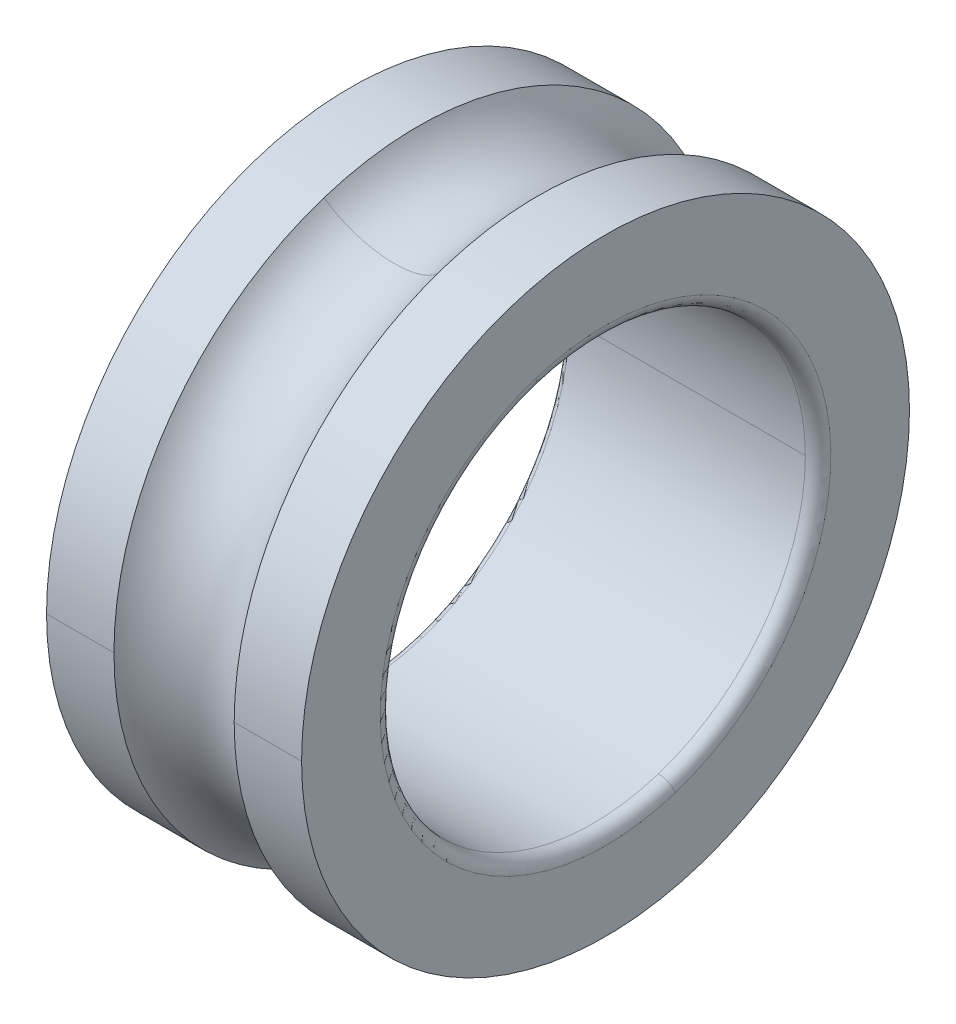
ISO-10303-21;
HEADER;
FILE_DESCRIPTION(('STEP AP214'),'2;1');
FILE_NAME('part.step','',(''),(''),'','','');
FILE_SCHEMA(('AUTOMOTIVE_DESIGN { 1 0 10303 214 1 1 1 1 }'));
ENDSEC;
DATA;
#1=APPLICATION_CONTEXT('core data for automotive mechanical design processes');
#2=APPLICATION_PROTOCOL_DEFINITION('international standard','automotive_design',2000,#1);
#3=PRODUCT_CONTEXT('',#1,'mechanical');
#4=PRODUCT('Part','Part','',(#3));
#5=PRODUCT_RELATED_PRODUCT_CATEGORY('part','',(#4));
#6=PRODUCT_DEFINITION_FORMATION('','',#4);
#7=PRODUCT_DEFINITION_CONTEXT('part definition',#1,'design');
#8=PRODUCT_DEFINITION('design','',#6,#7);
#9=PRODUCT_DEFINITION_SHAPE('','',#8);
#10=(LENGTH_UNIT() NAMED_UNIT(*) SI_UNIT(.MILLI.,.METRE.));
#11=(NAMED_UNIT(*) PLANE_ANGLE_UNIT() SI_UNIT($,.RADIAN.));
#12=(NAMED_UNIT(*) SI_UNIT($,.STERADIAN.) SOLID_ANGLE_UNIT());
#13=UNCERTAINTY_MEASURE_WITH_UNIT(LENGTH_MEASURE(1.E-05),#10,'distance_accuracy_value','');
#14=(GEOMETRIC_REPRESENTATION_CONTEXT(3) GLOBAL_UNCERTAINTY_ASSIGNED_CONTEXT((#13)) GLOBAL_UNIT_ASSIGNED_CONTEXT((#10,
#11,#12)) REPRESENTATION_CONTEXT('',''));
#15=CARTESIAN_POINT('',(0.,0.,0.));
#16=DIRECTION('',(0.,0.,1.));
#17=DIRECTION('',(1.,0.,0.));
#18=AXIS2_PLACEMENT_3D('',#15,#16,#17);
#19=CARTESIAN_POINT('',(0.,7.15,0.));
#20=DIRECTION('',(-1.,0.,0.));
#21=DIRECTION('',(0.,0.,1.));
#22=AXIS2_PLACEMENT_3D('',#19,#20,#21);
#23=PLANE('',#22);
#24=CARTESIAN_POINT('',(0.,0.,0.));
#25=DIRECTION('',(1.,0.,0.));
#26=DIRECTION('',(0.,0.,-1.));
#27=AXIS2_PLACEMENT_3D('',#24,#25,#26);
#28=CIRCLE('',#27,5.15);
#29=CARTESIAN_POINT('',(0.,4.89794105892004,1.59143752103098));
#30=VERTEX_POINT('',#29);
#31=CARTESIAN_POINT('',(0.,-4.89794105892004,-1.59143752103098));
#32=VERTEX_POINT('',#31);
#33=EDGE_CURVE('E11',#30,#32,#28,.T.);
#34=ORIENTED_EDGE('',*,*,#33,.T.);
#35=CARTESIAN_POINT('',(0.,-4.89794105892004,-1.59143752103098));
#36=CARTESIAN_POINT('',(0.,-4.39750759242677,-3.12948683662335));
#37=CARTESIAN_POINT('',(0.,-3.2957812973183,-4.47541454253524));
#38=CARTESIAN_POINT('',(0.,-1.68253692083019,-5.29531043653533));
#39=CARTESIAN_POINT('',(0.,1.78729033071666,-5.50071402699915));
#40=CARTESIAN_POINT('',(0.,4.47370634352078,-3.29502574514654));
#41=CARTESIAN_POINT('',(0.,5.29692574527113,-1.68347478043873));
#42=CARTESIAN_POINT('',(0.,5.39712458497675,0.0529820751716463));
#43=CARTESIAN_POINT('',(0.,4.89794105892004,1.59143752103098));
#44=B_SPLINE_CURVE_WITH_KNOTS('',5,(#35,#36,#37,#38,#39,#40,#41,#42,#43),.UNSPECIFIED.,.F.,.F.,
(6,3,6),(0.,1.5707963267949,3.14159265358979),.UNSPECIFIED.);
#45=EDGE_CURVE('E26',#32,#30,#44,.T.);
#46=ORIENTED_EDGE('',*,*,#45,.T.);
#47=EDGE_LOOP('',(#34,#46));
#48=FACE_BOUND('',#47,.T.);
#49=CARTESIAN_POINT('',(0.,0.,0.));
#50=DIRECTION('',(1.,0.,0.));
#51=DIRECTION('',(0.,0.,-1.));
#52=AXIS2_PLACEMENT_3D('',#49,#50,#51);
#53=CIRCLE('',#52,7.15);
#54=CARTESIAN_POINT('',(0.,0.,7.15));
#55=VERTEX_POINT('',#54);
#56=CARTESIAN_POINT('',(0.,0.,-7.15));
#57=VERTEX_POINT('',#56);
#58=EDGE_CURVE('E318',#55,#57,#53,.T.);
#59=ORIENTED_EDGE('',*,*,#58,.F.);
#60=CARTESIAN_POINT('',(0.,0.,0.));
#61=DIRECTION('',(1.,0.,0.));
#62=DIRECTION('',(0.,0.,-1.));
#63=AXIS2_PLACEMENT_3D('',#60,#61,#62);
#64=CIRCLE('',#63,7.15);
#65=EDGE_CURVE('E313',#57,#55,#64,.T.);
#66=ORIENTED_EDGE('',*,*,#65,.F.);
#67=EDGE_LOOP('',(#59,#66));
#68=FACE_BOUND('',#67,.T.);
#69=ADVANCED_FACE('F17',(#48,#68),#23,.T.);
#70=CARTESIAN_POINT('',(6.,0.,0.));
#71=DIRECTION('',(1.,0.,0.));
#72=DIRECTION('',(0.,-1.,0.));
#73=AXIS2_PLACEMENT_3D('',#70,#71,#72);
#74=CYLINDRICAL_SURFACE('',#73,7.15);
#75=DIRECTION('',(1.,0.,0.));
#76=VECTOR('',#75,1.);
#77=CARTESIAN_POINT('',(0.,0.,7.15));
#78=LINE('',#77,#76);
#79=CARTESIAN_POINT('',(1.5857864376269,0.,7.15));
#80=VERTEX_POINT('',#79);
#81=EDGE_CURVE('E309',#55,#80,#78,.T.);
#82=ORIENTED_EDGE('',*,*,#81,.T.);
#83=CARTESIAN_POINT('',(1.5857864376269,0.,0.));
#84=DIRECTION('',(1.,0.,0.));
#85=DIRECTION('',(0.,0.,-1.));
#86=AXIS2_PLACEMENT_3D('',#83,#84,#85);
#87=CIRCLE('',#86,7.15);
#88=CARTESIAN_POINT('',(1.5857864376269,6.80005409151035,2.20947150978087));
#89=VERTEX_POINT('',#88);
#90=EDGE_CURVE('E304',#89,#80,#87,.T.);
#91=ORIENTED_EDGE('',*,*,#90,.F.);
#92=CARTESIAN_POINT('',(1.5857864376269,0.,0.));
#93=DIRECTION('',(1.,0.,0.));
#94=DIRECTION('',(0.,0.,-1.));
#95=AXIS2_PLACEMENT_3D('',#92,#93,#94);
#96=CIRCLE('',#95,7.15);
#97=CARTESIAN_POINT('',(1.5857864376269,0.,-7.15));
#98=VERTEX_POINT('',#97);
#99=EDGE_CURVE('E299',#98,#89,#96,.T.);
#100=ORIENTED_EDGE('',*,*,#99,.F.);
#101=DIRECTION('',(1.,0.,0.));
#102=VECTOR('',#101,1.);
#103=CARTESIAN_POINT('',(0.,0.,-7.15));
#104=LINE('',#103,#102);
#105=EDGE_CURVE('E294',#57,#98,#104,.T.);
#106=ORIENTED_EDGE('',*,*,#105,.F.);
#107=ORIENTED_EDGE('',*,*,#65,.T.);
#108=EDGE_LOOP('',(#82,#91,#100,#106,#107));
#109=FACE_BOUND('',#108,.T.);
#110=ADVANCED_FACE('F339',(#109),#74,.T.);
#111=CARTESIAN_POINT('',(6.,0.,0.));
#112=DIRECTION('',(1.,0.,0.));
#113=DIRECTION('',(0.,1.,0.));
#114=AXIS2_PLACEMENT_3D('',#111,#112,#113);
#115=CYLINDRICAL_SURFACE('',#114,7.15);
#116=ORIENTED_EDGE('',*,*,#81,.F.);
#117=ORIENTED_EDGE('',*,*,#58,.T.);
#118=ORIENTED_EDGE('',*,*,#105,.T.);
#119=CARTESIAN_POINT('',(1.5857864376269,0.,0.));
#120=DIRECTION('',(1.,0.,0.));
#121=DIRECTION('',(0.,0.,-1.));
#122=AXIS2_PLACEMENT_3D('',#119,#120,#121);
#123=CIRCLE('',#122,7.15);
#124=CARTESIAN_POINT('',(1.58578643762691,-6.80005409151035,-2.20947150978087));
#125=VERTEX_POINT('',#124);
#126=EDGE_CURVE('E289',#125,#98,#123,.T.);
#127=ORIENTED_EDGE('',*,*,#126,.F.);
#128=CARTESIAN_POINT('',(1.5857864376269,0.,0.));
#129=DIRECTION('',(1.,0.,0.));
#130=DIRECTION('',(0.,0.,-1.));
#131=AXIS2_PLACEMENT_3D('',#128,#129,#130);
#132=CIRCLE('',#131,7.15);
#133=EDGE_CURVE('E284',#80,#125,#132,.T.);
#134=ORIENTED_EDGE('',*,*,#133,.F.);
#135=EDGE_LOOP('',(#116,#117,#118,#127,#134));
#136=FACE_BOUND('',#135,.T.);
#137=ADVANCED_FACE('F334',(#136),#115,.T.);
#138=CARTESIAN_POINT('',(3.,0.,0.));
#139=DIRECTION('',(1.,0.,0.));
#140=DIRECTION('',(0.,0.309016994374947,-0.951056516295154));
#141=AXIS2_PLACEMENT_3D('',#138,#139,#140);
#142=TOROIDAL_SURFACE('',#141,8.,1.65);
#143=CARTESIAN_POINT('',(3.,-7.60845213036123,-2.47213595499958));
#144=DIRECTION('',(0.,0.309016994374947,-0.951056516295154));
#145=DIRECTION('',(-0.857099128710967,0.48993820536417,0.159190572859821));
#146=AXIS2_PLACEMENT_3D('',#143,#144,#145);
#147=CIRCLE('',#146,1.65);
#148=CARTESIAN_POINT('',(4.4142135623731,-6.80005409151035,-2.20947150978087));
#149=VERTEX_POINT('',#148);
#150=EDGE_CURVE('E280',#125,#149,#147,.T.);
#151=ORIENTED_EDGE('',*,*,#150,.T.);
#152=CARTESIAN_POINT('',(4.4142135623731,0.,0.));
#153=DIRECTION('',(1.,0.,0.));
#154=DIRECTION('',(0.,0.,-1.));
#155=AXIS2_PLACEMENT_3D('',#152,#153,#154);
#156=CIRCLE('',#155,7.15);
#157=CARTESIAN_POINT('',(4.4142135623731,0.,7.15));
#158=VERTEX_POINT('',#157);
#159=EDGE_CURVE('E275',#158,#149,#156,.T.);
#160=ORIENTED_EDGE('',*,*,#159,.F.);
#161=CARTESIAN_POINT('',(4.4142135623731,0.,0.));
#162=DIRECTION('',(1.,0.,0.));
#163=DIRECTION('',(0.,0.,-1.));
#164=AXIS2_PLACEMENT_3D('',#161,#162,#163);
#165=CIRCLE('',#164,7.15);
#166=CARTESIAN_POINT('',(4.4142135623731,6.80005409151035,2.20947150978087));
#167=VERTEX_POINT('',#166);
#168=EDGE_CURVE('E270',#167,#158,#165,.T.);
#169=ORIENTED_EDGE('',*,*,#168,.F.);
#170=CARTESIAN_POINT('',(3.,7.60845213036123,2.47213595499958));
#171=DIRECTION('',(0.,-0.309016994374947,0.951056516295154));
#172=DIRECTION('',(-0.857099128710967,-0.48993820536417,-0.159190572859821));
#173=AXIS2_PLACEMENT_3D('',#170,#171,#172);
#174=CIRCLE('',#173,1.65);
#175=EDGE_CURVE('E265',#89,#167,#174,.T.);
#176=ORIENTED_EDGE('',*,*,#175,.F.);
#177=ORIENTED_EDGE('',*,*,#90,.T.);
#178=ORIENTED_EDGE('',*,*,#133,.T.);
#179=EDGE_LOOP('',(#151,#160,#169,#176,#177,#178));
#180=FACE_BOUND('',#179,.T.);
#181=ADVANCED_FACE('F346',(#180),#142,.F.);
#182=CARTESIAN_POINT('',(3.,0.,0.));
#183=DIRECTION('',(1.,0.,0.));
#184=DIRECTION('',(0.,-0.309016994374947,0.951056516295154));
#185=AXIS2_PLACEMENT_3D('',#182,#183,#184);
#186=TOROIDAL_SURFACE('',#185,8.,1.65);
#187=ORIENTED_EDGE('',*,*,#150,.F.);
#188=ORIENTED_EDGE('',*,*,#126,.T.);
#189=ORIENTED_EDGE('',*,*,#99,.T.);
#190=ORIENTED_EDGE('',*,*,#175,.T.);
#191=CARTESIAN_POINT('',(4.4142135623731,0.,0.));
#192=DIRECTION('',(1.,0.,0.));
#193=DIRECTION('',(0.,0.,-1.));
#194=AXIS2_PLACEMENT_3D('',#191,#192,#193);
#195=CIRCLE('',#194,7.15);
#196=CARTESIAN_POINT('',(4.4142135623731,0.,-7.15));
#197=VERTEX_POINT('',#196);
#198=EDGE_CURVE('E260',#197,#167,#195,.T.);
#199=ORIENTED_EDGE('',*,*,#198,.F.);
#200=CARTESIAN_POINT('',(4.4142135623731,0.,0.));
#201=DIRECTION('',(1.,0.,0.));
#202=DIRECTION('',(0.,0.,-1.));
#203=AXIS2_PLACEMENT_3D('',#200,#201,#202);
#204=CIRCLE('',#203,7.15);
#205=EDGE_CURVE('E255',#149,#197,#204,.T.);
#206=ORIENTED_EDGE('',*,*,#205,.F.);
#207=EDGE_LOOP('',(#187,#188,#189,#190,#199,#206));
#208=FACE_BOUND('',#207,.T.);
#209=ADVANCED_FACE('F343',(#208),#186,.F.);
#210=CARTESIAN_POINT('',(6.,0.,0.));
#211=DIRECTION('',(1.,0.,0.));
#212=DIRECTION('',(0.,1.,0.));
#213=AXIS2_PLACEMENT_3D('',#210,#211,#212);
#214=CYLINDRICAL_SURFACE('',#213,7.15);
#215=DIRECTION('',(1.,0.,0.));
#216=VECTOR('',#215,1.);
#217=CARTESIAN_POINT('',(4.4142135623731,0.,7.15));
#218=LINE('',#217,#216);
#219=CARTESIAN_POINT('',(6.,0.,7.15));
#220=VERTEX_POINT('',#219);
#221=EDGE_CURVE('E250',#158,#220,#218,.T.);
#222=ORIENTED_EDGE('',*,*,#221,.F.);
#223=ORIENTED_EDGE('',*,*,#159,.T.);
#224=ORIENTED_EDGE('',*,*,#205,.T.);
#225=DIRECTION('',(1.,0.,0.));
#226=VECTOR('',#225,1.);
#227=CARTESIAN_POINT('',(4.4142135623731,0.,-7.15));
#228=LINE('',#227,#226);
#229=CARTESIAN_POINT('',(6.,0.,-7.15));
#230=VERTEX_POINT('',#229);
#231=EDGE_CURVE('E246',#197,#230,#228,.T.);
#232=ORIENTED_EDGE('',*,*,#231,.T.);
#233=CARTESIAN_POINT('',(6.,0.,0.));
#234=DIRECTION('',(1.,0.,0.));
#235=DIRECTION('',(0.,0.,-1.));
#236=AXIS2_PLACEMENT_3D('',#233,#234,#235);
#237=CIRCLE('',#236,7.15);
#238=EDGE_CURVE('E241',#220,#230,#237,.T.);
#239=ORIENTED_EDGE('',*,*,#238,.F.);
#240=EDGE_LOOP('',(#222,#223,#224,#232,#239));
#241=FACE_BOUND('',#240,.T.);
#242=ADVANCED_FACE('F353',(#241),#214,.T.);
#243=CARTESIAN_POINT('',(6.,5.3,0.));
#244=DIRECTION('',(1.,0.,0.));
#245=DIRECTION('',(0.,0.,-1.));
#246=AXIS2_PLACEMENT_3D('',#243,#244,#245);
#247=PLANE('',#246);
#248=CARTESIAN_POINT('',(6.,0.,0.));
#249=DIRECTION('',(1.,0.,0.));
#250=DIRECTION('',(0.,0.,-1.));
#251=AXIS2_PLACEMENT_3D('',#248,#249,#250);
#252=CIRCLE('',#251,7.15);
#253=EDGE_CURVE('E238',#230,#220,#252,.T.);
#254=ORIENTED_EDGE('',*,*,#253,.T.);
#255=ORIENTED_EDGE('',*,*,#238,.T.);
#256=EDGE_LOOP('',(#254,#255));
#257=FACE_BOUND('',#256,.T.);
#258=CARTESIAN_POINT('',(6.,-5.0405995363642,-1.63779007018719));
#259=CARTESIAN_POINT('',(6.,-5.01380298148037,-1.72026733898135));
#260=CARTESIAN_POINT('',(6.,-4.984978757443,-1.80208561354531));
#261=CARTESIAN_POINT('',(6.,-4.92335196993667,-1.96420994002703));
#262=CARTESIAN_POINT('',(6.,-4.8905494064677,-2.04451599194481));
#263=CARTESIAN_POINT('',(6.,-4.82104293897371,-2.20342163894841));
#264=CARTESIAN_POINT('',(6.,-4.78433903494868,-2.28202123403423));
#265=CARTESIAN_POINT('',(6.,-4.70711885195929,-2.43732482035164));
#266=CARTESIAN_POINT('',(6.,-4.66660257299494,-2.51402881158322));
#267=CARTESIAN_POINT('',(6.,-4.5818551019765,-2.6653563482844));
#268=CARTESIAN_POINT('',(6.,-4.53762390992241,-2.73997989375401));
#269=CARTESIAN_POINT('',(6.,-4.44555320850426,-2.88696677908468));
#270=CARTESIAN_POINT('',(6.,-4.3977136991402,-2.95933011894575));
#271=CARTESIAN_POINT('',(6.,-4.29854160223004,-3.10162225946682));
#272=CARTESIAN_POINT('',(6.,-4.24720901468396,-3.17155106012682));
#273=CARTESIAN_POINT('',(6.,-4.14117442890684,-3.3088056587033));
#274=CARTESIAN_POINT('',(6.,-4.08647243067582,-3.37613145661977));
#275=CARTESIAN_POINT('',(6.,-3.97383080468432,-3.50801785568003));
#276=CARTESIAN_POINT('',(6.,-3.91589117692384,-3.57257845682382));
#277=CARTESIAN_POINT('',(6.,-3.79691387371247,-3.69877893027207));
#278=CARTESIAN_POINT('',(6.,-3.73587619826158,-3.76041880257652));
#279=CARTESIAN_POINT('',(6.,-3.61084984472199,-3.88062932247425));
#280=CARTESIAN_POINT('',(6.,-3.54686116663329,-3.93919997006752));
#281=CARTESIAN_POINT('',(6.,-3.41608696216278,-4.05313093872812));
#282=CARTESIAN_POINT('',(6.,-3.34930143578096,-4.10849125979545));
#283=CARTESIAN_POINT('',(6.,-3.21309442690312,-4.21586820754026));
#284=CARTESIAN_POINT('',(6.,-3.1436729444071,-4.26788483421774));
#285=CARTESIAN_POINT('',(6.,-3.00236126573381,-4.36844908057346));
#286=CARTESIAN_POINT('',(6.,-2.93047106955654,-4.41699670025169));
#287=CARTESIAN_POINT('',(6.,-2.78439515329993,-4.51050597714075));
#288=CARTESIAN_POINT('',(6.,-2.71020943322058,-4.55546763435156));
#289=CARTESIAN_POINT('',(6.,-2.55972118905744,-4.6416966697354));
#290=CARTESIAN_POINT('',(6.,-2.48341866497365,-4.68296404790842));
#291=CARTESIAN_POINT('',(6.,-2.32888063226544,-4.76170510848806));
#292=CARTESIAN_POINT('',(6.,-2.25064512364102,-4.79917879089467));
#293=CARTESIAN_POINT('',(6.,-2.09242959804445,-4.87024218255826));
#294=CARTESIAN_POINT('',(6.,-2.01244958107231,-4.90383189181524));
#295=CARTESIAN_POINT('',(6.,-1.85093771764659,-4.96704641662785));
#296=CARTESIAN_POINT('',(6.,-1.76940587119303,-4.99667123218348));
#297=CARTESIAN_POINT('',(6.,-1.60498676616393,-5.0518846008179));
#298=CARTESIAN_POINT('',(6.,-1.52209950758839,-5.07747315389668));
#299=CARTESIAN_POINT('',(6.,-1.35516926098133,-5.12455235251175));
#300=CARTESIAN_POINT('',(6.,-1.27112627294981,-5.14604299804802));
#301=CARTESIAN_POINT('',(6.,-1.10208703435023,-5.18487460873062));
#302=CARTESIAN_POINT('',(6.,-1.01709078378217,-5.20221557387694));
#303=CARTESIAN_POINT('',(6.,-0.846349783521949,-5.23270604787568));
#304=CARTESIAN_POINT('',(6.,-0.760605033829778,-5.24585555672811));
#305=CARTESIAN_POINT('',(6.,-0.588573601933679,-5.26793143982049));
#306=CARTESIAN_POINT('',(6.,-0.502286919729752,-5.27685781406044));
#307=CARTESIAN_POINT('',(6.,-0.329379494985391,-5.29046592351047));
#308=CARTESIAN_POINT('',(6.,-0.242758752444958,-5.29514765872055));
#309=CARTESIAN_POINT('',(6.,-0.0693918839834476,-5.30025521140063));
#310=CARTESIAN_POINT('',(6.,0.0173542419376295,-5.30068102887064));
#311=CARTESIAN_POINT('',(6.,0.190762898145021,-5.297275720239));
#312=CARTESIAN_POINT('',(6.,0.277425428431336,-5.29344459413736));
#313=CARTESIAN_POINT('',(6.,0.450458115743003,-5.28153462788077));
#314=CARTESIAN_POINT('',(6.,0.536828272768355,-5.27345578772582));
#315=CARTESIAN_POINT('',(6.,0.709068140284688,-5.25306985599617));
#316=CARTESIAN_POINT('',(6.,0.794937850775669,-5.24076276442147));
#317=CARTESIAN_POINT('',(6.,0.965969957569393,-5.21194997871389));
#318=CARTESIAN_POINT('',(6.,1.05113235387213,-5.19544428458102));
#319=CARTESIAN_POINT('',(6.,1.22054466861734,-5.15827405742));
#320=CARTESIAN_POINT('',(6.,1.3047945870598,-5.13760952439185));
#321=CARTESIAN_POINT('',(6.,1.4721789806515,-5.09217140211033));
#322=CARTESIAN_POINT('',(6.,1.55531345580074,-5.06739781285696));
#323=CARTESIAN_POINT('',(6.,1.72026668457362,-5.01380125987144));
#324=CARTESIAN_POINT('',(6.,1.80208543819727,-4.98497829613928));
#325=CARTESIAN_POINT('',(6.,1.96421011537504,-4.9233524312404));
#326=CARTESIAN_POINT('',(6.,2.04451603892915,-4.89054953007367));
#327=CARTESIAN_POINT('',(6.,2.20342159196403,-4.82104281536775));
#328=CARTESIAN_POINT('',(6.,2.2820212214448,-4.78433900182857));
#329=CARTESIAN_POINT('',(6.,2.43732483294105,-4.70711888507941));
#330=CARTESIAN_POINT('',(6.,2.51402881495653,-4.66660258186945));
#331=CARTESIAN_POINT('',(6.,2.66535634491106,-4.581855093102));
#332=CARTESIAN_POINT('',(6.,2.73997989285011,-4.5376239075445));
#333=CARTESIAN_POINT('',(6.,2.88696677998855,-4.44555321088219));
#334=CARTESIAN_POINT('',(6.,2.95933011918793,-4.39771369977737));
#335=CARTESIAN_POINT('',(6.,3.10162225922461,-4.29854160159289));
#336=CARTESIAN_POINT('',(6.,3.17155106006191,-4.24720901451324));
#337=CARTESIAN_POINT('',(6.,3.30880565876818,-4.14117442907758));
#338=CARTESIAN_POINT('',(6.,3.37613145663715,-4.08647243072158));
#339=CARTESIAN_POINT('',(6.,3.50801785566263,-3.97383080463858));
#340=CARTESIAN_POINT('',(6.,3.57257845681915,-3.91589117691159));
#341=CARTESIAN_POINT('',(6.,3.69877893027671,-3.79691387372474));
#342=CARTESIAN_POINT('',(6.,3.76041880257776,-3.73587619826487));
#343=CARTESIAN_POINT('',(6.,3.88062932247299,-3.61084984471872));
#344=CARTESIAN_POINT('',(6.,3.93919997006717,-3.54686116663243));
#345=CARTESIAN_POINT('',(6.,4.05313093872844,-3.41608696216367));
#346=CARTESIAN_POINT('',(6.,4.10849125979553,-3.34930143578121));
#347=CARTESIAN_POINT('',(6.,4.21586820754016,-3.2130944269029));
#348=CARTESIAN_POINT('',(6.,4.26788483421771,-3.14367294440705));
#349=CARTESIAN_POINT('',(6.,4.36844908057347,-3.00236126573388));
#350=CARTESIAN_POINT('',(6.,4.41699670025169,-2.93047106955657));
#351=CARTESIAN_POINT('',(6.,4.51050597714073,-2.78439515329993));
#352=CARTESIAN_POINT('',(6.,4.55546763435155,-2.71020943322059));
#353=CARTESIAN_POINT('',(6.,4.64169666973539,-2.55972118905746));
#354=CARTESIAN_POINT('',(6.,4.68296404790842,-2.48341866497366));
#355=CARTESIAN_POINT('',(6.,4.76170510848805,-2.32888063226545));
#356=CARTESIAN_POINT('',(6.,4.79917879089466,-2.25064512364103));
#357=CARTESIAN_POINT('',(6.,4.87024218255826,-2.09242959804446));
#358=CARTESIAN_POINT('',(6.,4.90383189181526,-2.01244958107231));
#359=CARTESIAN_POINT('',(6.,4.96704641662783,-1.85093771764661));
#360=CARTESIAN_POINT('',(6.,4.99667123218341,-1.76940587119306));
#361=CARTESIAN_POINT('',(6.,5.05188460081796,-1.60498676616392));
#362=CARTESIAN_POINT('',(6.,5.07747315389692,-1.52209950758834));
#363=CARTESIAN_POINT('',(6.,5.1245523525115,-1.35516926098141));
#364=CARTESIAN_POINT('',(6.,5.14604299804711,-1.27112627295007));
#365=CARTESIAN_POINT('',(6.,5.18487460873152,-1.10208703434999));
#366=CARTESIAN_POINT('',(6.,5.20221557388032,-1.01709078378127));
#367=CARTESIAN_POINT('',(6.,5.23270604787229,-0.846349783522884));
#368=CARTESIAN_POINT('',(6.,5.24585555671545,-0.760605033833228));
#369=CARTESIAN_POINT('',(6.,5.26793143983314,-0.588573601930259));
#370=CARTESIAN_POINT('',(6.,5.27685781410767,-0.502286919716947));
#371=CARTESIAN_POINT('',(6.,5.29046592346324,-0.32937949499823));
#372=CARTESIAN_POINT('',(6.,5.29514765854428,-0.242758752492825));
#373=CARTESIAN_POINT('',(6.,5.3002552115769,-0.0693918839356178));
#374=CARTESIAN_POINT('',(6.,5.30068102952847,0.0173542421161853));
#375=CARTESIAN_POINT('',(6.,5.29727571958118,0.190762897966428));
#376=CARTESIAN_POINT('',(6.,5.2934445916823,0.277425427764867));
#377=CARTESIAN_POINT('',(6.,5.28153463033583,0.450458116409436));
#378=CARTESIAN_POINT('',(6.,5.27345579688824,0.536828275255567));
#379=CARTESIAN_POINT('',(6.,5.25306984683375,0.709068137797446));
#380=CARTESIAN_POINT('',(6.,5.24076273022685,0.794937841493196));
#381=CARTESIAN_POINT('',(6.,5.21195001290851,0.965969966851841));
#382=CARTESIAN_POINT('',(6.,5.19544441219706,1.05113238851474));
#383=CARTESIAN_POINT('',(6.,5.15827392980396,1.22054463397471));
#384=CARTESIAN_POINT('',(6.,5.13760904812232,1.30479445777179));
#385=CARTESIAN_POINT('',(6.,5.09217187837987,1.47217910993948));
#386=CARTESIAN_POINT('',(6.,5.06739959031906,1.5553139383101));
#387=CARTESIAN_POINT('',(6.,5.04059953636421,1.63779007018716));
#388=B_SPLINE_CURVE_WITH_KNOTS('',3,(#258,#259,#260,#261,#262,#263,#264,#265,#266,#267,#268,
#269,#270,#271,#272,#273,#274,#275,#276,#277,#278,#279,#280,#281,#282,#283,#284,#285,#286,#287,
#288,#289,#290,#291,#292,#293,#294,#295,#296,#297,#298,#299,#300,#301,#302,#303,#304,#305,#306,
#307,#308,#309,#310,#311,#312,#313,#314,#315,#316,#317,#318,#319,#320,#321,#322,#323,#324,#325,
#326,#327,#328,#329,#330,#331,#332,#333,#334,#335,#336,#337,#338,#339,#340,#341,#342,#343,#344,
#345,#346,#347,#348,#349,#350,#351,#352,#353,#354,#355,#356,#357,#358,#359,#360,#361,#362,#363,
#364,#365,#366,#367,#368,#369,#370,#371,#372,#373,#374,#375,#376,#377,#378,#379,#380,#381,#382,
#383,#384,#385,#386,#387),.UNSPECIFIED.,.F.,.F.,(4,2,2,2,2,2,2,2,2,2,2,2,2,2,2,2,2,2,2,2,2,2,2,
2,2,2,2,2,2,2,2,2,2,2,2,2,2,2,2,2,2,2,2,2,2,2,2,2,2,2,2,2,2,2,2,2,2,2,2,2,2,2,2,2,4),(0.,
0.260137022342863,0.520274044685728,0.780411067028592,1.04054808937146,1.30068511171432,
1.56082213405718,1.82095915640005,2.08109617874291,2.34123320108577,2.60137022342864,
2.8615072457715,3.12164426811437,3.38178129045723,3.6419183128001,3.90205533514296,
4.16219235748582,4.42232937982869,4.68246640217155,4.94260342451441,5.20274044685728,
5.46287746920014,5.723014491543,5.98315151388587,6.24328853622873,6.5034255585716,
6.76356258091446,7.02369960325732,7.28383662560019,7.54397364794305,7.80411067028592,
8.06424769262878,8.32438471497164,8.5845217373145,8.84465875965737,9.10479578200023,
9.3649328043431,9.62506982668596,9.88520684902883,10.1453438713717,10.4054808937146,
10.6656179160574,10.9257549384003,11.1858919607431,11.446028983086,11.7061660054289,
11.9663030277717,12.2264400501146,12.4865770724575,12.7467140948003,13.0068511171432,
13.2669881394861,13.5271251618289,13.7872621841718,14.0473992065146,14.3075362288575,
14.5676732512004,14.8278102735432,15.0879472958861,15.348084318229,15.6082213405718,
15.8683583629147,16.1284953852576,16.3886324076004,16.6487694299433),.UNSPECIFIED.);
#389=CARTESIAN_POINT('',(6.,-5.0405995363642,-1.63779007018718));
#390=VERTEX_POINT('',#389);
#391=CARTESIAN_POINT('',(6.,5.0405995363642,1.63779007018718));
#392=VERTEX_POINT('',#391);
#393=EDGE_CURVE('E237',#390,#392,#388,.T.);
#394=ORIENTED_EDGE('',*,*,#393,.F.);
#395=CARTESIAN_POINT('',(6.,5.0405995363642,1.63779007018719));
#396=CARTESIAN_POINT('',(6.,5.01380298148038,1.72026733898135));
#397=CARTESIAN_POINT('',(6.,4.984978757443,1.80208561354531));
#398=CARTESIAN_POINT('',(6.,4.92335196993667,1.96420994002703));
#399=CARTESIAN_POINT('',(6.,4.8905494064677,2.04451599194481));
#400=CARTESIAN_POINT('',(6.,4.82104293897371,2.20342163894841));
#401=CARTESIAN_POINT('',(6.,4.78433903494868,2.28202123403423));
#402=CARTESIAN_POINT('',(6.,4.70711885195929,2.43732482035164));
#403=CARTESIAN_POINT('',(6.,4.66660257299494,2.51402881158322));
#404=CARTESIAN_POINT('',(6.,4.5818551019765,2.6653563482844));
#405=CARTESIAN_POINT('',(6.,4.53762390992241,2.73997989375401));
#406=CARTESIAN_POINT('',(6.,4.44555320850426,2.88696677908468));
#407=CARTESIAN_POINT('',(6.,4.3977136991402,2.95933011894575));
#408=CARTESIAN_POINT('',(6.,4.29854160223004,3.10162225946682));
#409=CARTESIAN_POINT('',(6.,4.24720901468395,3.17155106012682));
#410=CARTESIAN_POINT('',(6.,4.14117442890684,3.3088056587033));
#411=CARTESIAN_POINT('',(6.,4.08647243067582,3.37613145661977));
#412=CARTESIAN_POINT('',(6.,3.97383080468432,3.50801785568003));
#413=CARTESIAN_POINT('',(6.,3.91589117692384,3.57257845682382));
#414=CARTESIAN_POINT('',(6.,3.79691387371247,3.69877893027207));
#415=CARTESIAN_POINT('',(6.,3.73587619826158,3.76041880257652));
#416=CARTESIAN_POINT('',(6.,3.61084984472199,3.88062932247425));
#417=CARTESIAN_POINT('',(6.,3.54686116663329,3.93919997006752));
#418=CARTESIAN_POINT('',(6.,3.41608696216278,4.05313093872812));
#419=CARTESIAN_POINT('',(6.,3.34930143578096,4.10849125979545));
#420=CARTESIAN_POINT('',(6.,3.21309442690312,4.21586820754026));
#421=CARTESIAN_POINT('',(6.,3.14367294440709,4.26788483421774));
#422=CARTESIAN_POINT('',(6.,3.0023612657338,4.36844908057346));
#423=CARTESIAN_POINT('',(6.,2.93047106955654,4.41699670025169));
#424=CARTESIAN_POINT('',(6.,2.78439515329992,4.51050597714075));
#425=CARTESIAN_POINT('',(6.,2.71020943322057,4.55546763435156));
#426=CARTESIAN_POINT('',(6.,2.55972118905743,4.6416966697354));
#427=CARTESIAN_POINT('',(6.,2.48341866497364,4.68296404790843));
#428=CARTESIAN_POINT('',(6.,2.32888063226543,4.76170510848806));
#429=CARTESIAN_POINT('',(6.,2.25064512364101,4.79917879089468));
#430=CARTESIAN_POINT('',(6.,2.09242959804445,4.87024218255827));
#431=CARTESIAN_POINT('',(6.,2.0124495810723,4.90383189181525));
#432=CARTESIAN_POINT('',(6.,1.85093771764659,4.96704641662785));
#433=CARTESIAN_POINT('',(6.,1.76940587119302,4.99667123218348));
#434=CARTESIAN_POINT('',(6.,1.60498676616392,5.0518846008179));
#435=CARTESIAN_POINT('',(6.,1.52209950758839,5.07747315389669));
#436=CARTESIAN_POINT('',(6.,1.35516926098133,5.12455235251175));
#437=CARTESIAN_POINT('',(6.,1.2711262729498,5.14604299804803));
#438=CARTESIAN_POINT('',(6.,1.10208703435022,5.18487460873062));
#439=CARTESIAN_POINT('',(6.,1.01709078378216,5.20221557387694));
#440=CARTESIAN_POINT('',(6.,0.846349783521938,5.23270604787568));
#441=CARTESIAN_POINT('',(6.,0.760605033829767,5.24585555672811));
#442=CARTESIAN_POINT('',(6.,0.588573601933669,5.26793143982049));
#443=CARTESIAN_POINT('',(6.,0.502286919729742,5.27685781406044));
#444=CARTESIAN_POINT('',(6.,0.329379494985383,5.29046592351047));
#445=CARTESIAN_POINT('',(6.,0.242758752444951,5.29514765872055));
#446=CARTESIAN_POINT('',(6.,0.0693918839834412,5.30025521140063));
#447=CARTESIAN_POINT('',(6.,-0.017354241937636,5.30068102887064));
#448=CARTESIAN_POINT('',(6.,-0.190762898145028,5.29727572023901));
#449=CARTESIAN_POINT('',(6.,-0.277425428431343,5.29344459413736));
#450=CARTESIAN_POINT('',(6.,-0.45045811574301,5.28153462788077));
#451=CARTESIAN_POINT('',(6.,-0.536828272768361,5.27345578772581));
#452=CARTESIAN_POINT('',(6.,-0.709068140284695,5.25306985599617));
#453=CARTESIAN_POINT('',(6.,-0.794937850775677,5.24076276442146));
#454=CARTESIAN_POINT('',(6.,-0.965969957569402,5.21194997871389));
#455=CARTESIAN_POINT('',(6.,-1.05113235387214,5.19544428458102));
#456=CARTESIAN_POINT('',(6.,-1.22054466861735,5.15827405741999));
#457=CARTESIAN_POINT('',(6.,-1.30479458705981,5.13760952439184));
#458=CARTESIAN_POINT('',(6.,-1.47217898065151,5.09217140211033));
#459=CARTESIAN_POINT('',(6.,-1.55531345580074,5.06739781285696));
#460=CARTESIAN_POINT('',(6.,-1.72026668457363,5.01380125987144));
#461=CARTESIAN_POINT('',(6.,-1.80208543819728,4.98497829613928));
#462=CARTESIAN_POINT('',(6.,-1.96421011537505,4.9233524312404));
#463=CARTESIAN_POINT('',(6.,-2.04451603892916,4.89054953007367));
#464=CARTESIAN_POINT('',(6.,-2.20342159196404,4.82104281536775));
#465=CARTESIAN_POINT('',(6.,-2.28202122144481,4.78433900182856));
#466=CARTESIAN_POINT('',(6.,-2.43732483294105,4.70711888507941));
#467=CARTESIAN_POINT('',(6.,-2.51402881495654,4.66660258186945));
#468=CARTESIAN_POINT('',(6.,-2.66535634491107,4.58185509310199));
#469=CARTESIAN_POINT('',(6.,-2.73997989285012,4.5376239075445));
#470=CARTESIAN_POINT('',(6.,-2.88696677998855,4.44555321088218));
#471=CARTESIAN_POINT('',(6.,-2.95933011918793,4.39771369977736));
#472=CARTESIAN_POINT('',(6.,-3.10162225922462,4.29854160159289));
#473=CARTESIAN_POINT('',(6.,-3.17155106006192,4.24720901451323));
#474=CARTESIAN_POINT('',(6.,-3.30880565876819,4.14117442907757));
#475=CARTESIAN_POINT('',(6.,-3.37613145663715,4.08647243072157));
#476=CARTESIAN_POINT('',(6.,-3.50801785566264,3.97383080463858));
#477=CARTESIAN_POINT('',(6.,-3.57257845681916,3.91589117691159));
#478=CARTESIAN_POINT('',(6.,-3.69877893027672,3.79691387372473));
#479=CARTESIAN_POINT('',(6.,-3.76041880257777,3.73587619826487));
#480=CARTESIAN_POINT('',(6.,-3.880629322473,3.61084984471871));
#481=CARTESIAN_POINT('',(6.,-3.93919997006718,3.54686116663242));
#482=CARTESIAN_POINT('',(6.,-4.05313093872845,3.41608696216367));
#483=CARTESIAN_POINT('',(6.,-4.10849125979554,3.34930143578121));
#484=CARTESIAN_POINT('',(6.,-4.21586820754017,3.21309442690289));
#485=CARTESIAN_POINT('',(6.,-4.26788483421771,3.14367294440704));
#486=CARTESIAN_POINT('',(6.,-4.36844908057348,3.00236126573387));
#487=CARTESIAN_POINT('',(6.,-4.4169967002517,2.93047106955656));
#488=CARTESIAN_POINT('',(6.,-4.51050597714074,2.78439515329991));
#489=CARTESIAN_POINT('',(6.,-4.55546763435156,2.71020943322058));
#490=CARTESIAN_POINT('',(6.,-4.6416966697354,2.55972118905744));
#491=CARTESIAN_POINT('',(6.,-4.68296404790843,2.48341866497365));
#492=CARTESIAN_POINT('',(6.,-4.76170510848806,2.32888063226544));
#493=CARTESIAN_POINT('',(6.,-4.79917879089467,2.25064512364102));
#494=CARTESIAN_POINT('',(6.,-4.87024218255827,2.09242959804445));
#495=CARTESIAN_POINT('',(6.,-4.90383189181526,2.0124495810723));
#496=CARTESIAN_POINT('',(6.,-4.96704641662783,1.8509377176466));
#497=CARTESIAN_POINT('',(6.,-4.99667123218342,1.76940587119305));
#498=CARTESIAN_POINT('',(6.,-5.05188460081796,1.60498676616391));
#499=CARTESIAN_POINT('',(6.,-5.07747315389693,1.52209950758833));
#500=CARTESIAN_POINT('',(6.,-5.1245523525115,1.3551692609814));
#501=CARTESIAN_POINT('',(6.,-5.14604299804712,1.27112627295005));
#502=CARTESIAN_POINT('',(6.,-5.18487460873153,1.10208703434998));
#503=CARTESIAN_POINT('',(6.,-5.20221557388033,1.01709078378125));
#504=CARTESIAN_POINT('',(6.,-5.23270604787229,0.846349783522868));
#505=CARTESIAN_POINT('',(6.,-5.24585555671545,0.760605033833212));
#506=CARTESIAN_POINT('',(6.,-5.26793143983314,0.588573601930243));
#507=CARTESIAN_POINT('',(6.,-5.27685781410768,0.502286919716931));
#508=CARTESIAN_POINT('',(6.,-5.29046592346324,0.329379494998214));
#509=CARTESIAN_POINT('',(6.,-5.29514765854429,0.242758752492809));
#510=CARTESIAN_POINT('',(6.,-5.3002552115769,0.0693918839356017));
#511=CARTESIAN_POINT('',(6.,-5.30068102952847,-0.0173542421162013));
#512=CARTESIAN_POINT('',(6.,-5.29727571958118,-0.190762897966443));
#513=CARTESIAN_POINT('',(6.,-5.2934445916823,-0.277425427764883));
#514=CARTESIAN_POINT('',(6.,-5.28153463033583,-0.450458116409452));
#515=CARTESIAN_POINT('',(6.,-5.27345579688824,-0.536828275255583));
#516=CARTESIAN_POINT('',(6.,-5.25306984683375,-0.709068137797462));
#517=CARTESIAN_POINT('',(6.,-5.24076273022685,-0.794937841493212));
#518=CARTESIAN_POINT('',(6.,-5.21195001290851,-0.965969966851857));
#519=CARTESIAN_POINT('',(6.,-5.19544441219706,-1.05113238851475));
#520=CARTESIAN_POINT('',(6.,-5.15827392980396,-1.22054463397473));
#521=CARTESIAN_POINT('',(6.,-5.13760904812231,-1.3047944577718));
#522=CARTESIAN_POINT('',(6.,-5.09217187837986,-1.4721791099395));
#523=CARTESIAN_POINT('',(6.,-5.06739959031906,-1.55531393831012));
#524=CARTESIAN_POINT('',(6.,-5.0405995363642,-1.63779007018718));
#525=B_SPLINE_CURVE_WITH_KNOTS('',3,(#395,#396,#397,#398,#399,#400,#401,#402,#403,#404,#405,
#406,#407,#408,#409,#410,#411,#412,#413,#414,#415,#416,#417,#418,#419,#420,#421,#422,#423,#424,
#425,#426,#427,#428,#429,#430,#431,#432,#433,#434,#435,#436,#437,#438,#439,#440,#441,#442,#443,
#444,#445,#446,#447,#448,#449,#450,#451,#452,#453,#454,#455,#456,#457,#458,#459,#460,#461,#462,
#463,#464,#465,#466,#467,#468,#469,#470,#471,#472,#473,#474,#475,#476,#477,#478,#479,#480,#481,
#482,#483,#484,#485,#486,#487,#488,#489,#490,#491,#492,#493,#494,#495,#496,#497,#498,#499,#500,
#501,#502,#503,#504,#505,#506,#507,#508,#509,#510,#511,#512,#513,#514,#515,#516,#517,#518,#519,
#520,#521,#522,#523,#524),.UNSPECIFIED.,.F.,.F.,(4,2,2,2,2,2,2,2,2,2,2,2,2,2,2,2,2,2,2,2,2,2,2,
2,2,2,2,2,2,2,2,2,2,2,2,2,2,2,2,2,2,2,2,2,2,2,2,2,2,2,2,2,2,2,2,2,2,2,2,2,2,2,2,2,4),(0.,
0.260137022342863,0.520274044685728,0.780411067028592,1.04054808937146,1.30068511171432,
1.56082213405719,1.82095915640005,2.08109617874291,2.34123320108578,2.60137022342864,
2.86150724577151,3.12164426811437,3.38178129045723,3.6419183128001,3.90205533514296,
4.16219235748583,4.42232937982869,4.68246640217156,4.94260342451442,5.20274044685728,
5.46287746920015,5.72301449154301,5.98315151388588,6.24328853622874,6.5034255585716,
6.76356258091447,7.02369960325733,7.28383662560019,7.54397364794306,7.80411067028592,
8.06424769262879,8.32438471497165,8.58452173731452,8.84465875965738,9.10479578200025,
9.36493280434311,9.62506982668597,9.88520684902883,10.1453438713717,10.4054808937146,
10.6656179160574,10.9257549384003,11.1858919607432,11.446028983086,11.7061660054289,
11.9663030277717,12.2264400501146,12.4865770724575,12.7467140948003,13.0068511171432,
13.2669881394861,13.5271251618289,13.7872621841718,14.0473992065147,14.3075362288575,
14.5676732512004,14.8278102735433,15.0879472958861,15.348084318229,15.6082213405718,
15.8683583629147,16.1284953852576,16.3886324076004,16.6487694299433),.UNSPECIFIED.);
#526=EDGE_CURVE('E200',#392,#390,#525,.T.);
#527=ORIENTED_EDGE('',*,*,#526,.F.);
#528=EDGE_LOOP('',(#394,#527));
#529=FACE_BOUND('',#528,.T.);
#530=ADVANCED_FACE('F185',(#257,#529),#247,.T.);
#531=CARTESIAN_POINT('',(5.70000000000012,0.,0.));
#532=DIRECTION('',(1.,0.,0.));
#533=DIRECTION('',(0.,0.309016994374947,-0.951056516295154));
#534=AXIS2_PLACEMENT_3D('',#531,#532,#533);
#535=TOROIDAL_SURFACE('',#534,5.29999999999988,0.299999999999878);
#536=CARTESIAN_POINT('',(5.70000000000012,-5.0405995363642,-1.63779007018718));
#537=DIRECTION('',(0.,0.309016994374947,-0.951056516295154));
#538=DIRECTION('',(-3.96719694132885E-13,0.951056516295154,0.309016994374947));
#539=AXIS2_PLACEMENT_3D('',#536,#537,#538);
#540=CIRCLE('',#539,0.299999999999877);
#541=CARTESIAN_POINT('',(5.7,-4.75528258147577,-1.54508497187474));
#542=VERTEX_POINT('',#541);
#543=EDGE_CURVE('E211',#542,#390,#540,.T.);
#544=ORIENTED_EDGE('',*,*,#543,.F.);
#545=CARTESIAN_POINT('',(5.7,0.,0.));
#546=DIRECTION('',(1.,0.,0.));
#547=DIRECTION('',(0.,0.,-1.));
#548=AXIS2_PLACEMENT_3D('',#545,#546,#547);
#549=CIRCLE('',#548,5.);
#550=CARTESIAN_POINT('',(5.7,0.,5.));
#551=VERTEX_POINT('',#550);
#552=EDGE_CURVE('E206',#551,#542,#549,.T.);
#553=ORIENTED_EDGE('',*,*,#552,.F.);
#554=CARTESIAN_POINT('',(5.7,0.,0.));
#555=DIRECTION('',(1.,0.,0.));
#556=DIRECTION('',(0.,0.,-1.));
#557=AXIS2_PLACEMENT_3D('',#554,#555,#556);
#558=CIRCLE('',#557,5.);
#559=CARTESIAN_POINT('',(5.7,4.75528258147577,1.54508497187474));
#560=VERTEX_POINT('',#559);
#561=EDGE_CURVE('E202',#560,#551,#558,.T.);
#562=ORIENTED_EDGE('',*,*,#561,.F.);
#563=CARTESIAN_POINT('',(5.70000000000012,5.0405995363642,1.63779007018718));
#564=DIRECTION('',(0.,-0.309016994374947,0.951056516295154));
#565=DIRECTION('',(-3.9968028886522E-13,-0.951056516295154,-0.309016994374947));
#566=AXIS2_PLACEMENT_3D('',#563,#564,#565);
#567=CIRCLE('',#566,0.299999999999877);
#568=EDGE_CURVE('E159',#560,#392,#567,.T.);
#569=ORIENTED_EDGE('',*,*,#568,.T.);
#570=ORIENTED_EDGE('',*,*,#526,.T.);
#571=EDGE_LOOP('',(#544,#553,#562,#569,#570));
#572=FACE_BOUND('',#571,.T.);
#573=ADVANCED_FACE('F179',(#572),#535,.T.);
#574=CARTESIAN_POINT('',(5.70000000000012,0.,0.));
#575=DIRECTION('',(1.,0.,0.));
#576=DIRECTION('',(0.,-0.309016994374947,0.951056516295154));
#577=AXIS2_PLACEMENT_3D('',#574,#575,#576);
#578=TOROIDAL_SURFACE('',#577,5.29999999999988,0.299999999999878);
#579=ORIENTED_EDGE('',*,*,#543,.T.);
#580=ORIENTED_EDGE('',*,*,#393,.T.);
#581=ORIENTED_EDGE('',*,*,#568,.F.);
#582=CARTESIAN_POINT('',(5.7,0.,0.));
#583=DIRECTION('',(1.,0.,0.));
#584=DIRECTION('',(0.,0.,-1.));
#585=AXIS2_PLACEMENT_3D('',#582,#583,#584);
#586=CIRCLE('',#585,5.);
#587=CARTESIAN_POINT('',(5.7,0.,-5.));
#588=VERTEX_POINT('',#587);
#589=EDGE_CURVE('E154',#588,#560,#586,.T.);
#590=ORIENTED_EDGE('',*,*,#589,.F.);
#591=CARTESIAN_POINT('',(5.7,0.,0.));
#592=DIRECTION('',(1.,0.,0.));
#593=DIRECTION('',(0.,0.,-1.));
#594=AXIS2_PLACEMENT_3D('',#591,#592,#593);
#595=CIRCLE('',#594,5.);
#596=EDGE_CURVE('E149',#542,#588,#595,.T.);
#597=ORIENTED_EDGE('',*,*,#596,.F.);
#598=EDGE_LOOP('',(#579,#580,#581,#590,#597));
#599=FACE_BOUND('',#598,.T.);
#600=ADVANCED_FACE('F168',(#599),#578,.T.);
#601=CARTESIAN_POINT('',(6.,0.,0.));
#602=DIRECTION('',(1.,0.,0.));
#603=DIRECTION('',(0.,1.,0.));
#604=AXIS2_PLACEMENT_3D('',#601,#602,#603);
#605=CYLINDRICAL_SURFACE('',#604,5.);
#606=DIRECTION('',(1.,0.,0.));
#607=VECTOR('',#606,1.);
#608=CARTESIAN_POINT('',(0.15,0.,5.));
#609=LINE('',#608,#607);
#610=CARTESIAN_POINT('',(0.15,0.,5.));
#611=VERTEX_POINT('',#610);
#612=EDGE_CURVE('E125',#611,#551,#609,.T.);
#613=ORIENTED_EDGE('',*,*,#612,.T.);
#614=ORIENTED_EDGE('',*,*,#552,.T.);
#615=ORIENTED_EDGE('',*,*,#596,.T.);
#616=DIRECTION('',(1.,0.,0.));
#617=VECTOR('',#616,1.);
#618=CARTESIAN_POINT('',(0.15,0.,-5.));
#619=LINE('',#618,#617);
#620=CARTESIAN_POINT('',(0.15,0.,-5.));
#621=VERTEX_POINT('',#620);
#622=EDGE_CURVE('E142',#621,#588,#619,.T.);
#623=ORIENTED_EDGE('',*,*,#622,.F.);
#624=CARTESIAN_POINT('',(0.15,0.,0.));
#625=DIRECTION('',(1.,0.,0.));
#626=DIRECTION('',(0.,0.,-1.));
#627=AXIS2_PLACEMENT_3D('',#624,#625,#626);
#628=CIRCLE('',#627,5.);
#629=CARTESIAN_POINT('',(0.15,-4.7552825814758,-1.54508497187475));
#630=VERTEX_POINT('',#629);
#631=EDGE_CURVE('E117',#630,#621,#628,.T.);
#632=ORIENTED_EDGE('',*,*,#631,.F.);
#633=CARTESIAN_POINT('',(0.15,0.,0.));
#634=DIRECTION('',(1.,0.,0.));
#635=DIRECTION('',(0.,0.,-1.));
#636=AXIS2_PLACEMENT_3D('',#633,#634,#635);
#637=CIRCLE('',#636,5.);
#638=EDGE_CURVE('E135',#611,#630,#637,.T.);
#639=ORIENTED_EDGE('',*,*,#638,.F.);
#640=EDGE_LOOP('',(#613,#614,#615,#623,#632,#639));
#641=FACE_BOUND('',#640,.T.);
#642=ADVANCED_FACE('F178',(#641),#605,.F.);
#643=CARTESIAN_POINT('',(0.149999999999969,0.,0.));
#644=DIRECTION('',(1.,0.,0.));
#645=DIRECTION('',(0.,0.309016994374947,-0.951056516295154));
#646=AXIS2_PLACEMENT_3D('',#643,#644,#645);
#647=TOROIDAL_SURFACE('',#646,5.15,0.149999999999969);
#648=CARTESIAN_POINT('',(0.149999999999969,-4.89794105892004,-1.59143752103098));
#649=DIRECTION('',(0.,0.309016994374947,-0.951056516295154));
#650=DIRECTION('',(-1.,0.,0.));
#651=AXIS2_PLACEMENT_3D('',#648,#649,#650);
#652=CIRCLE('',#651,0.149999999999969);
#653=EDGE_CURVE('E110',#32,#630,#652,.T.);
#654=ORIENTED_EDGE('',*,*,#653,.F.);
#655=ORIENTED_EDGE('',*,*,#33,.F.);
#656=CARTESIAN_POINT('',(0.149999999999969,4.89794105892004,1.59143752103098));
#657=DIRECTION('',(0.,-0.309016994374947,0.951056516295154));
#658=DIRECTION('',(-1.,0.,0.));
#659=AXIS2_PLACEMENT_3D('',#656,#657,#658);
#660=CIRCLE('',#659,0.149999999999969);
#661=CARTESIAN_POINT('',(0.15,4.7552825814758,1.54508497187475));
#662=VERTEX_POINT('',#661);
#663=EDGE_CURVE('E103',#30,#662,#660,.T.);
#664=ORIENTED_EDGE('',*,*,#663,.T.);
#665=CARTESIAN_POINT('',(0.15,0.,0.));
#666=DIRECTION('',(1.,0.,0.));
#667=DIRECTION('',(0.,0.,-1.));
#668=AXIS2_PLACEMENT_3D('',#665,#666,#667);
#669=CIRCLE('',#668,5.);
#670=EDGE_CURVE('E108',#662,#611,#669,.T.);
#671=ORIENTED_EDGE('',*,*,#670,.T.);
#672=ORIENTED_EDGE('',*,*,#638,.T.);
#673=EDGE_LOOP('',(#654,#655,#664,#671,#672));
#674=FACE_BOUND('',#673,.T.);
#675=ADVANCED_FACE('F105',(#674),#647,.T.);
#676=CARTESIAN_POINT('',(6.,0.,0.));
#677=DIRECTION('',(1.,0.,0.));
#678=DIRECTION('',(0.,-1.,0.));
#679=AXIS2_PLACEMENT_3D('',#676,#677,#678);
#680=CYLINDRICAL_SURFACE('',#679,5.);
#681=ORIENTED_EDGE('',*,*,#612,.F.);
#682=ORIENTED_EDGE('',*,*,#670,.F.);
#683=CARTESIAN_POINT('',(0.15,0.,0.));
#684=DIRECTION('',(1.,0.,0.));
#685=DIRECTION('',(0.,0.,-1.));
#686=AXIS2_PLACEMENT_3D('',#683,#684,#685);
#687=CIRCLE('',#686,5.);
#688=EDGE_CURVE('E114',#621,#662,#687,.T.);
#689=ORIENTED_EDGE('',*,*,#688,.F.);
#690=ORIENTED_EDGE('',*,*,#622,.T.);
#691=ORIENTED_EDGE('',*,*,#589,.T.);
#692=ORIENTED_EDGE('',*,*,#561,.T.);
#693=EDGE_LOOP('',(#681,#682,#689,#690,#691,#692));
#694=FACE_BOUND('',#693,.T.);
#695=ADVANCED_FACE('F122',(#694),#680,.F.);
#696=CARTESIAN_POINT('',(0.149999999999969,0.,0.));
#697=DIRECTION('',(1.,0.,0.));
#698=DIRECTION('',(0.,-0.309016994374947,0.951056516295154));
#699=AXIS2_PLACEMENT_3D('',#696,#697,#698);
#700=TOROIDAL_SURFACE('',#699,5.15,0.149999999999969);
#701=ORIENTED_EDGE('',*,*,#653,.T.);
#702=ORIENTED_EDGE('',*,*,#631,.T.);
#703=ORIENTED_EDGE('',*,*,#688,.T.);
#704=ORIENTED_EDGE('',*,*,#663,.F.);
#705=ORIENTED_EDGE('',*,*,#45,.F.);
#706=EDGE_LOOP('',(#701,#702,#703,#704,#705));
#707=FACE_BOUND('',#706,.T.);
#708=ADVANCED_FACE('F116',(#707),#700,.T.);
#709=CARTESIAN_POINT('',(6.,0.,0.));
#710=DIRECTION('',(1.,0.,0.));
#711=DIRECTION('',(0.,-1.,0.));
#712=AXIS2_PLACEMENT_3D('',#709,#710,#711);
#713=CYLINDRICAL_SURFACE('',#712,7.15);
#714=ORIENTED_EDGE('',*,*,#221,.T.);
#715=ORIENTED_EDGE('',*,*,#253,.F.);
#716=ORIENTED_EDGE('',*,*,#231,.F.);
#717=ORIENTED_EDGE('',*,*,#198,.T.);
#718=ORIENTED_EDGE('',*,*,#168,.T.);
#719=EDGE_LOOP('',(#714,#715,#716,#717,#718));
#720=FACE_BOUND('',#719,.T.);
#721=ADVANCED_FACE('F350',(#720),#713,.T.);
#722=CLOSED_SHELL('',(#69,#110,#137,#181,#209,#242,#530,#573,#600,#642,#675,#695,#708,#721));
#723=MANIFOLD_SOLID_BREP('B1',#722);
#724=ADVANCED_BREP_SHAPE_REPRESENTATION('',(#18,#723),#14);
#725=SHAPE_DEFINITION_REPRESENTATION(#9,#724);
ENDSEC;
END-ISO-10303-21;
